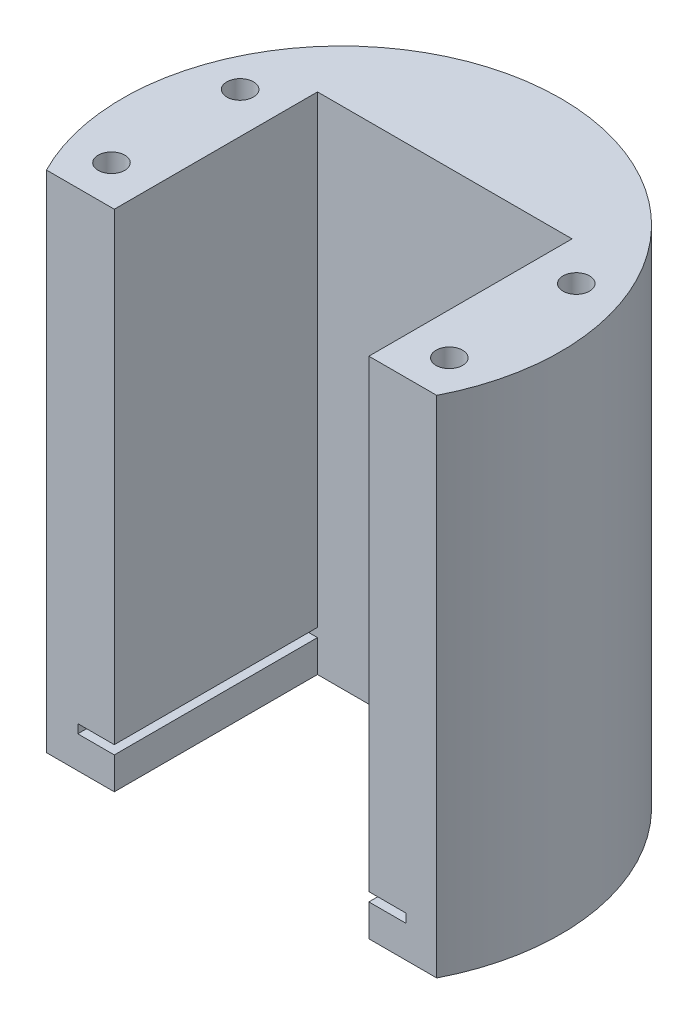
ISO-10303-21;
HEADER;
FILE_DESCRIPTION(('STEP AP214'),'2;1');
FILE_NAME('part.step','',(''),(''),'','','');
FILE_SCHEMA(('AUTOMOTIVE_DESIGN { 1 0 10303 214 1 1 1 1 }'));
ENDSEC;
DATA;
#1=APPLICATION_CONTEXT('core data for automotive mechanical design processes');
#2=APPLICATION_PROTOCOL_DEFINITION('international standard','automotive_design',2000,#1);
#3=PRODUCT_CONTEXT('',#1,'mechanical');
#4=PRODUCT('Part','Part','',(#3));
#5=PRODUCT_RELATED_PRODUCT_CATEGORY('part','',(#4));
#6=PRODUCT_DEFINITION_FORMATION('','',#4);
#7=PRODUCT_DEFINITION_CONTEXT('part definition',#1,'design');
#8=PRODUCT_DEFINITION('design','',#6,#7);
#9=PRODUCT_DEFINITION_SHAPE('','',#8);
#10=(LENGTH_UNIT() NAMED_UNIT(*) SI_UNIT(.MILLI.,.METRE.));
#11=(NAMED_UNIT(*) PLANE_ANGLE_UNIT() SI_UNIT($,.RADIAN.));
#12=(NAMED_UNIT(*) SI_UNIT($,.STERADIAN.) SOLID_ANGLE_UNIT());
#13=UNCERTAINTY_MEASURE_WITH_UNIT(LENGTH_MEASURE(1.E-05),#10,'distance_accuracy_value','');
#14=(GEOMETRIC_REPRESENTATION_CONTEXT(3) GLOBAL_UNCERTAINTY_ASSIGNED_CONTEXT((#13)) GLOBAL_UNIT_ASSIGNED_CONTEXT((#10,
#11,#12)) REPRESENTATION_CONTEXT('',''));
#15=CARTESIAN_POINT('',(0.,0.,0.));
#16=DIRECTION('',(0.,0.,1.));
#17=DIRECTION('',(1.,0.,0.));
#18=AXIS2_PLACEMENT_3D('',#15,#16,#17);
#19=CARTESIAN_POINT('',(-28.7576569336667,114.,0.));
#20=DIRECTION('',(-1.,0.,0.));
#21=DIRECTION('',(0.,0.,1.));
#22=AXIS2_PLACEMENT_3D('',#19,#20,#21);
#23=PLANE('',#22);
#24=DIRECTION('',(0.,-1.,0.));
#25=VECTOR('',#24,1.);
#26=CARTESIAN_POINT('',(-28.7576569336667,114.,-23.3211190092713));
#27=LINE('',#26,#25);
#28=CARTESIAN_POINT('',(-28.7576569336667,7.22982796789173,-23.3211190092712));
#29=VERTEX_POINT('',#28);
#30=CARTESIAN_POINT('',(-28.7576569336667,0.,-23.3211190092713));
#31=VERTEX_POINT('',#30);
#32=EDGE_CURVE('E292',#29,#31,#27,.T.);
#33=ORIENTED_EDGE('',*,*,#32,.F.);
#34=DIRECTION('',(0.,0.,1.));
#35=VECTOR('',#34,1.);
#36=CARTESIAN_POINT('',(-28.7576569336667,7.22982796789173,0.));
#37=LINE('',#36,#35);
#38=CARTESIAN_POINT('',(-28.7576569336667,7.22982796789173,22.5811058758501));
#39=VERTEX_POINT('',#38);
#40=EDGE_CURVE('E350',#29,#39,#37,.T.);
#41=ORIENTED_EDGE('',*,*,#40,.T.);
#42=DIRECTION('',(0.,-1.,0.));
#43=VECTOR('',#42,1.);
#44=CARTESIAN_POINT('',(-28.7576569336667,114.,22.5811058758501));
#45=LINE('',#44,#43);
#46=CARTESIAN_POINT('',(-28.7576569336667,0.,22.5811058758501));
#47=VERTEX_POINT('',#46);
#48=EDGE_CURVE('E281',#39,#47,#45,.T.);
#49=ORIENTED_EDGE('',*,*,#48,.T.);
#50=DIRECTION('',(0.,0.,-1.));
#51=VECTOR('',#50,1.);
#52=CARTESIAN_POINT('',(-28.7576569336667,0.,0.));
#53=LINE('',#52,#51);
#54=EDGE_CURVE('E401',#47,#31,#53,.T.);
#55=ORIENTED_EDGE('',*,*,#54,.T.);
#56=EDGE_LOOP('',(#33,#41,#49,#55));
#57=FACE_BOUND('',#56,.T.);
#58=ADVANCED_FACE('F45',(#57),#23,.F.);
#59=CARTESIAN_POINT('',(28.7576569336667,114.,0.));
#60=DIRECTION('',(-1.,0.,0.));
#61=DIRECTION('',(0.,0.,1.));
#62=AXIS2_PLACEMENT_3D('',#59,#60,#61);
#63=PLANE('',#62);
#64=DIRECTION('',(0.,0.,1.));
#65=VECTOR('',#64,1.);
#66=CARTESIAN_POINT('',(28.7576569336667,7.22982796789173,0.));
#67=LINE('',#66,#65);
#68=CARTESIAN_POINT('',(28.7576569336667,7.22982796789173,-23.3211190092713));
#69=VERTEX_POINT('',#68);
#70=CARTESIAN_POINT('',(28.7576569336667,7.22982796789173,22.5811058758501));
#71=VERTEX_POINT('',#70);
#72=EDGE_CURVE('E348',#69,#71,#67,.T.);
#73=ORIENTED_EDGE('',*,*,#72,.F.);
#74=DIRECTION('',(0.,-1.,0.));
#75=VECTOR('',#74,1.);
#76=CARTESIAN_POINT('',(28.7576569336667,114.,-23.3211190092713));
#77=LINE('',#76,#75);
#78=CARTESIAN_POINT('',(28.7576569336667,0.,-23.3211190092713));
#79=VERTEX_POINT('',#78);
#80=EDGE_CURVE('E200',#69,#79,#77,.T.);
#81=ORIENTED_EDGE('',*,*,#80,.T.);
#82=DIRECTION('',(0.,0.,-1.));
#83=VECTOR('',#82,1.);
#84=CARTESIAN_POINT('',(28.7576569336667,0.,0.));
#85=LINE('',#84,#83);
#86=CARTESIAN_POINT('',(28.7576569336667,0.,22.5811058758501));
#87=VERTEX_POINT('',#86);
#88=EDGE_CURVE('E405',#87,#79,#85,.T.);
#89=ORIENTED_EDGE('',*,*,#88,.F.);
#90=DIRECTION('',(0.,-1.,0.));
#91=VECTOR('',#90,1.);
#92=CARTESIAN_POINT('',(28.7576569336667,114.,22.5811058758501));
#93=LINE('',#92,#91);
#94=EDGE_CURVE('E385',#71,#87,#93,.T.);
#95=ORIENTED_EDGE('',*,*,#94,.F.);
#96=EDGE_LOOP('',(#73,#81,#89,#95));
#97=FACE_BOUND('',#96,.T.);
#98=ADVANCED_FACE('F416',(#97),#63,.T.);
#99=CARTESIAN_POINT('',(0.,114.,22.5811058758501));
#100=DIRECTION('',(0.,0.,-1.));
#101=DIRECTION('',(-1.,0.,0.));
#102=AXIS2_PLACEMENT_3D('',#99,#100,#101);
#103=PLANE('',#102);
#104=DIRECTION('',(0.,1.,0.));
#105=VECTOR('',#104,1.);
#106=CARTESIAN_POINT('',(37.1164505725113,7.22982796789173,22.5811058758501));
#107=LINE('',#106,#105);
#108=CARTESIAN_POINT('',(37.1164505725113,7.22982796789173,22.5811058758501));
#109=VERTEX_POINT('',#108);
#110=CARTESIAN_POINT('',(37.1164505725113,9.22982796789173,22.5811058758501));
#111=VERTEX_POINT('',#110);
#112=EDGE_CURVE('E253',#109,#111,#107,.T.);
#113=ORIENTED_EDGE('',*,*,#112,.F.);
#114=DIRECTION('',(1.,0.,0.));
#115=VECTOR('',#114,1.);
#116=CARTESIAN_POINT('',(-37.0063716597704,7.22982796789173,22.5811058758501));
#117=LINE('',#116,#115);
#118=EDGE_CURVE('E265',#71,#109,#117,.T.);
#119=ORIENTED_EDGE('',*,*,#118,.F.);
#120=ORIENTED_EDGE('',*,*,#94,.T.);
#121=DIRECTION('',(1.,0.,0.));
#122=VECTOR('',#121,1.);
#123=CARTESIAN_POINT('',(0.,0.,22.5811058758501));
#124=LINE('',#123,#122);
#125=CARTESIAN_POINT('',(44.0830416081246,0.,22.5811058758501));
#126=VERTEX_POINT('',#125);
#127=EDGE_CURVE('E394',#87,#126,#124,.T.);
#128=ORIENTED_EDGE('',*,*,#127,.T.);
#129=DIRECTION('',(0.,-1.,0.));
#130=VECTOR('',#129,1.);
#131=CARTESIAN_POINT('',(44.0830416081246,114.,22.5811058758501));
#132=LINE('',#131,#130);
#133=CARTESIAN_POINT('',(44.0830416081246,114.,22.5811058758501));
#134=VERTEX_POINT('',#133);
#135=EDGE_CURVE('E297',#134,#126,#132,.T.);
#136=ORIENTED_EDGE('',*,*,#135,.F.);
#137=DIRECTION('',(1.,0.,0.));
#138=VECTOR('',#137,1.);
#139=CARTESIAN_POINT('',(0.,114.,22.5811058758501));
#140=LINE('',#139,#138);
#141=CARTESIAN_POINT('',(28.7576569336667,114.,22.5811058758501));
#142=VERTEX_POINT('',#141);
#143=EDGE_CURVE('E367',#142,#134,#140,.T.);
#144=ORIENTED_EDGE('',*,*,#143,.F.);
#145=CARTESIAN_POINT('',(28.7576569336667,9.22982796789173,22.5811058758501));
#146=VERTEX_POINT('',#145);
#147=EDGE_CURVE('E263',#142,#146,#93,.T.);
#148=ORIENTED_EDGE('',*,*,#147,.T.);
#149=DIRECTION('',(-1.,0.,0.));
#150=VECTOR('',#149,1.);
#151=CARTESIAN_POINT('',(-37.0063716597704,9.22982796789173,22.5811058758501));
#152=LINE('',#151,#150);
#153=EDGE_CURVE('E68',#111,#146,#152,.T.);
#154=ORIENTED_EDGE('',*,*,#153,.F.);
#155=EDGE_LOOP('',(#113,#119,#120,#128,#136,#144,#148,#154));
#156=FACE_BOUND('',#155,.T.);
#157=ADVANCED_FACE('F261',(#156),#103,.F.);
#158=CARTESIAN_POINT('',(0.,114.,0.));
#159=DIRECTION('',(0.,-1.,0.));
#160=DIRECTION('',(0.,0.,-1.));
#161=AXIS2_PLACEMENT_3D('',#158,#159,#160);
#162=CYLINDRICAL_SURFACE('',#161,49.53);
#163=CARTESIAN_POINT('',(0.,0.,0.));
#164=DIRECTION('',(0.,1.,0.));
#165=DIRECTION('',(0.,0.,1.));
#166=AXIS2_PLACEMENT_3D('',#163,#164,#165);
#167=CIRCLE('',#166,49.53);
#168=CARTESIAN_POINT('',(-44.0830416081246,0.,22.5811058758501));
#169=VERTEX_POINT('',#168);
#170=EDGE_CURVE('E397',#126,#169,#167,.T.);
#171=ORIENTED_EDGE('',*,*,#170,.T.);
#172=DIRECTION('',(0.,-1.,0.));
#173=VECTOR('',#172,1.);
#174=CARTESIAN_POINT('',(-44.0830416081246,114.,22.5811058758501));
#175=LINE('',#174,#173);
#176=CARTESIAN_POINT('',(-44.0830416081246,114.,22.5811058758501));
#177=VERTEX_POINT('',#176);
#178=EDGE_CURVE('E291',#177,#169,#175,.T.);
#179=ORIENTED_EDGE('',*,*,#178,.F.);
#180=CARTESIAN_POINT('',(0.,114.,0.));
#181=DIRECTION('',(0.,1.,0.));
#182=DIRECTION('',(0.,0.,1.));
#183=AXIS2_PLACEMENT_3D('',#180,#181,#182);
#184=CIRCLE('',#183,49.53);
#185=EDGE_CURVE('E370',#134,#177,#184,.T.);
#186=ORIENTED_EDGE('',*,*,#185,.F.);
#187=ORIENTED_EDGE('',*,*,#135,.T.);
#188=EDGE_LOOP('',(#171,#179,#186,#187));
#189=FACE_BOUND('',#188,.T.);
#190=ADVANCED_FACE('F426',(#189),#162,.T.);
#191=CARTESIAN_POINT('',(0.,114.,22.5811058758501));
#192=DIRECTION('',(0.,0.,1.));
#193=DIRECTION('',(1.,0.,0.));
#194=AXIS2_PLACEMENT_3D('',#191,#192,#193);
#195=PLANE('',#194);
#196=CARTESIAN_POINT('',(-37.0063716597704,7.22982796789173,22.5811058758501));
#197=VERTEX_POINT('',#196);
#198=EDGE_CURVE('E258',#197,#39,#117,.T.);
#199=ORIENTED_EDGE('',*,*,#198,.F.);
#200=DIRECTION('',(0.,-1.,0.));
#201=VECTOR('',#200,1.);
#202=CARTESIAN_POINT('',(-37.0063716597704,7.22982796789173,22.5811058758501));
#203=LINE('',#202,#201);
#204=CARTESIAN_POINT('',(-37.0063716597704,9.22982796789173,22.5811058758501));
#205=VERTEX_POINT('',#204);
#206=EDGE_CURVE('E236',#205,#197,#203,.T.);
#207=ORIENTED_EDGE('',*,*,#206,.F.);
#208=CARTESIAN_POINT('',(-28.7576569336667,9.22982796789173,22.5811058758501));
#209=VERTEX_POINT('',#208);
#210=EDGE_CURVE('E257',#209,#205,#152,.T.);
#211=ORIENTED_EDGE('',*,*,#210,.F.);
#212=CARTESIAN_POINT('',(-28.7576569336667,114.,22.5811058758501));
#213=VERTEX_POINT('',#212);
#214=EDGE_CURVE('E287',#213,#209,#45,.T.);
#215=ORIENTED_EDGE('',*,*,#214,.F.);
#216=DIRECTION('',(-1.,0.,0.));
#217=VECTOR('',#216,1.);
#218=CARTESIAN_POINT('',(0.,114.,22.5811058758501));
#219=LINE('',#218,#217);
#220=EDGE_CURVE('E372',#213,#177,#219,.T.);
#221=ORIENTED_EDGE('',*,*,#220,.T.);
#222=ORIENTED_EDGE('',*,*,#178,.T.);
#223=DIRECTION('',(-1.,0.,0.));
#224=VECTOR('',#223,1.);
#225=CARTESIAN_POINT('',(0.,0.,22.5811058758501));
#226=LINE('',#225,#224);
#227=EDGE_CURVE('E283',#47,#169,#226,.T.);
#228=ORIENTED_EDGE('',*,*,#227,.F.);
#229=ORIENTED_EDGE('',*,*,#48,.F.);
#230=EDGE_LOOP('',(#199,#207,#211,#215,#221,#222,#228,#229));
#231=FACE_BOUND('',#230,.T.);
#232=ADVANCED_FACE('F279',(#231),#195,.T.);
#233=ORIENTED_EDGE('',*,*,#214,.T.);
#234=DIRECTION('',(0.,0.,-1.));
#235=VECTOR('',#234,1.);
#236=CARTESIAN_POINT('',(-28.7576569336667,9.22982796789173,0.));
#237=LINE('',#236,#235);
#238=CARTESIAN_POINT('',(-28.7576569336667,9.22982796789173,-23.3211190092713));
#239=VERTEX_POINT('',#238);
#240=EDGE_CURVE('E334',#209,#239,#237,.T.);
#241=ORIENTED_EDGE('',*,*,#240,.T.);
#242=CARTESIAN_POINT('',(-28.7576569336667,114.,-23.3211190092713));
#243=VERTEX_POINT('',#242);
#244=EDGE_CURVE('E288',#243,#239,#27,.T.);
#245=ORIENTED_EDGE('',*,*,#244,.F.);
#246=DIRECTION('',(0.,0.,-1.));
#247=VECTOR('',#246,1.);
#248=CARTESIAN_POINT('',(-28.7576569336667,114.,0.));
#249=LINE('',#248,#247);
#250=EDGE_CURVE('E375',#213,#243,#249,.T.);
#251=ORIENTED_EDGE('',*,*,#250,.F.);
#252=EDGE_LOOP('',(#233,#241,#245,#251));
#253=FACE_BOUND('',#252,.T.);
#254=ADVANCED_FACE('F438',(#253),#23,.F.);
#255=CARTESIAN_POINT('',(0.,114.,-23.3211190092713));
#256=DIRECTION('',(0.,0.,-1.));
#257=DIRECTION('',(-1.,0.,0.));
#258=AXIS2_PLACEMENT_3D('',#255,#256,#257);
#259=PLANE('',#258);
#260=ORIENTED_EDGE('',*,*,#244,.T.);
#261=DIRECTION('',(-1.,0.,0.));
#262=VECTOR('',#261,1.);
#263=CARTESIAN_POINT('',(-37.0063716597704,9.22982796789173,-23.3211190092712));
#264=LINE('',#263,#262);
#265=CARTESIAN_POINT('',(-37.0063716597704,9.22982796789173,-23.3211190092712));
#266=VERTEX_POINT('',#265);
#267=EDGE_CURVE('E60',#239,#266,#264,.T.);
#268=ORIENTED_EDGE('',*,*,#267,.T.);
#269=DIRECTION('',(0.,-1.,0.));
#270=VECTOR('',#269,1.);
#271=CARTESIAN_POINT('',(-37.0063716597704,7.22982796789173,-23.3211190092712));
#272=LINE('',#271,#270);
#273=CARTESIAN_POINT('',(-37.0063716597704,7.22982796789173,-23.3211190092712));
#274=VERTEX_POINT('',#273);
#275=EDGE_CURVE('E238',#266,#274,#272,.T.);
#276=ORIENTED_EDGE('',*,*,#275,.T.);
#277=DIRECTION('',(1.,0.,0.));
#278=VECTOR('',#277,1.);
#279=CARTESIAN_POINT('',(-37.0063716597704,7.22982796789173,-23.3211190092712));
#280=LINE('',#279,#278);
#281=EDGE_CURVE('E204',#274,#29,#280,.T.);
#282=ORIENTED_EDGE('',*,*,#281,.T.);
#283=ORIENTED_EDGE('',*,*,#32,.T.);
#284=DIRECTION('',(1.,0.,0.));
#285=VECTOR('',#284,1.);
#286=CARTESIAN_POINT('',(0.,0.,-23.3211190092713));
#287=LINE('',#286,#285);
#288=EDGE_CURVE('E403',#31,#79,#287,.T.);
#289=ORIENTED_EDGE('',*,*,#288,.T.);
#290=ORIENTED_EDGE('',*,*,#80,.F.);
#291=CARTESIAN_POINT('',(37.1164505725113,7.22982796789173,-23.3211190092712));
#292=VERTEX_POINT('',#291);
#293=EDGE_CURVE('E193',#69,#292,#280,.T.);
#294=ORIENTED_EDGE('',*,*,#293,.T.);
#295=DIRECTION('',(0.,1.,0.));
#296=VECTOR('',#295,1.);
#297=CARTESIAN_POINT('',(37.1164505725113,7.22982796789173,-23.3211190092712));
#298=LINE('',#297,#296);
#299=CARTESIAN_POINT('',(37.1164505725113,9.22982796789173,-23.3211190092712));
#300=VERTEX_POINT('',#299);
#301=EDGE_CURVE('E198',#292,#300,#298,.T.);
#302=ORIENTED_EDGE('',*,*,#301,.T.);
#303=CARTESIAN_POINT('',(28.7576569336667,9.22982796789173,-23.3211190092713));
#304=VERTEX_POINT('',#303);
#305=EDGE_CURVE('E242',#300,#304,#264,.T.);
#306=ORIENTED_EDGE('',*,*,#305,.T.);
#307=CARTESIAN_POINT('',(28.7576569336667,114.,-23.3211190092713));
#308=VERTEX_POINT('',#307);
#309=EDGE_CURVE('E410',#308,#304,#77,.T.);
#310=ORIENTED_EDGE('',*,*,#309,.F.);
#311=DIRECTION('',(1.,0.,0.));
#312=VECTOR('',#311,1.);
#313=CARTESIAN_POINT('',(0.,114.,-23.3211190092713));
#314=LINE('',#313,#312);
#315=EDGE_CURVE('E377',#243,#308,#314,.T.);
#316=ORIENTED_EDGE('',*,*,#315,.F.);
#317=EDGE_LOOP('',(#260,#268,#276,#282,#283,#289,#290,#294,#302,#306,#310,#316));
#318=FACE_BOUND('',#317,.T.);
#319=ADVANCED_FACE('F196',(#318),#259,.F.);
#320=DIRECTION('',(0.,0.,-1.));
#321=VECTOR('',#320,1.);
#322=CARTESIAN_POINT('',(28.7576569336667,9.22982796789173,0.));
#323=LINE('',#322,#321);
#324=EDGE_CURVE('E328',#146,#304,#323,.T.);
#325=ORIENTED_EDGE('',*,*,#324,.F.);
#326=ORIENTED_EDGE('',*,*,#147,.F.);
#327=DIRECTION('',(0.,0.,-1.));
#328=VECTOR('',#327,1.);
#329=CARTESIAN_POINT('',(28.7576569336667,114.,0.));
#330=LINE('',#329,#328);
#331=EDGE_CURVE('E379',#142,#308,#330,.T.);
#332=ORIENTED_EDGE('',*,*,#331,.T.);
#333=ORIENTED_EDGE('',*,*,#309,.T.);
#334=EDGE_LOOP('',(#325,#326,#332,#333));
#335=FACE_BOUND('',#334,.T.);
#336=ADVANCED_FACE('F433',(#335),#63,.T.);
#337=CARTESIAN_POINT('',(-38.1613419725484,114.,13.8126429549861));
#338=DIRECTION('',(0.,-1.,0.));
#339=DIRECTION('',(0.,0.,-1.));
#340=AXIS2_PLACEMENT_3D('',#337,#338,#339);
#341=CYLINDRICAL_SURFACE('',#340,3.);
#342=DIRECTION('',(0.,-1.,0.));
#343=VECTOR('',#342,1.);
#344=CARTESIAN_POINT('',(-37.0063716597704,114.,11.0438808531432));
#345=LINE('',#344,#343);
#346=CARTESIAN_POINT('',(-37.0063716597704,9.22982796789173,11.0438808531432));
#347=VERTEX_POINT('',#346);
#348=CARTESIAN_POINT('',(-37.0063716597704,7.22982796789173,11.0438808531432));
#349=VERTEX_POINT('',#348);
#350=EDGE_CURVE('E354',#347,#349,#345,.T.);
#351=ORIENTED_EDGE('',*,*,#350,.F.);
#352=CARTESIAN_POINT('',(-38.1613419725484,9.22982796789173,13.8126429549861));
#353=DIRECTION('',(0.,1.,0.));
#354=DIRECTION('',(0.,0.,1.));
#355=AXIS2_PLACEMENT_3D('',#352,#353,#354);
#356=CIRCLE('',#355,3.);
#357=CARTESIAN_POINT('',(-37.0063716597704,9.22982796789173,16.581405056829));
#358=VERTEX_POINT('',#357);
#359=EDGE_CURVE('E323',#358,#347,#356,.T.);
#360=ORIENTED_EDGE('',*,*,#359,.F.);
#361=DIRECTION('',(0.,-1.,0.));
#362=VECTOR('',#361,1.);
#363=CARTESIAN_POINT('',(-37.0063716597704,114.,16.581405056829));
#364=LINE('',#363,#362);
#365=CARTESIAN_POINT('',(-37.0063716597704,7.22982796789173,16.581405056829));
#366=VERTEX_POINT('',#365);
#367=EDGE_CURVE('E352',#366,#358,#364,.F.);
#368=ORIENTED_EDGE('',*,*,#367,.F.);
#369=CARTESIAN_POINT('',(-38.1613419725484,7.22982796789173,13.8126429549861));
#370=DIRECTION('',(0.,-1.,0.));
#371=DIRECTION('',(0.,0.,-1.));
#372=AXIS2_PLACEMENT_3D('',#369,#370,#371);
#373=CIRCLE('',#372,3.);
#374=EDGE_CURVE('E346',#349,#366,#373,.T.);
#375=ORIENTED_EDGE('',*,*,#374,.F.);
#376=EDGE_LOOP('',(#351,#360,#368,#375));
#377=FACE_BOUND('',#376,.T.);
#378=CARTESIAN_POINT('',(-38.1613419725484,114.,13.8126429549861));
#379=DIRECTION('',(0.,1.,0.));
#380=DIRECTION('',(0.,0.,1.));
#381=AXIS2_PLACEMENT_3D('',#378,#379,#380);
#382=CIRCLE('',#381,3.);
#383=CARTESIAN_POINT('',(-38.1613419725484,114.,16.8126429549861));
#384=VERTEX_POINT('',#383);
#385=EDGE_CURVE('E364',#384,#384,#382,.T.);
#386=ORIENTED_EDGE('',*,*,#385,.T.);
#387=EDGE_LOOP('',(#386));
#388=FACE_BOUND('',#387,.T.);
#389=CARTESIAN_POINT('',(-38.1613419725484,0.,13.8126429549861));
#390=DIRECTION('',(0.,1.,0.));
#391=DIRECTION('',(0.,0.,1.));
#392=AXIS2_PLACEMENT_3D('',#389,#390,#391);
#393=CIRCLE('',#392,3.);
#394=CARTESIAN_POINT('',(-38.1613419725484,0.,16.8126429549861));
#395=VERTEX_POINT('',#394);
#396=EDGE_CURVE('E391',#395,#395,#393,.T.);
#397=ORIENTED_EDGE('',*,*,#396,.F.);
#398=EDGE_LOOP('',(#397));
#399=FACE_BOUND('',#398,.T.);
#400=ADVANCED_FACE('F441',(#377,#388,#399),#341,.F.);
#401=CARTESIAN_POINT('',(-37.9712293616954,114.,-15.0603910993191));
#402=DIRECTION('',(0.,-1.,0.));
#403=DIRECTION('',(0.,0.,-1.));
#404=AXIS2_PLACEMENT_3D('',#401,#402,#403);
#405=CYLINDRICAL_SURFACE('',#404,3.);
#406=DIRECTION('',(0.,-1.,0.));
#407=VECTOR('',#406,1.);
#408=CARTESIAN_POINT('',(-37.0063716597704,114.,-17.9009983609862));
#409=LINE('',#408,#407);
#410=CARTESIAN_POINT('',(-37.0063716597704,9.22982796789173,-17.9009983609862));
#411=VERTEX_POINT('',#410);
#412=CARTESIAN_POINT('',(-37.0063716597704,7.22982796789173,-17.9009983609862));
#413=VERTEX_POINT('',#412);
#414=EDGE_CURVE('E11',#411,#413,#409,.T.);
#415=ORIENTED_EDGE('',*,*,#414,.F.);
#416=CARTESIAN_POINT('',(-37.9712293616954,9.22982796789173,-15.0603910993191));
#417=DIRECTION('',(0.,1.,0.));
#418=DIRECTION('',(0.,0.,1.));
#419=AXIS2_PLACEMENT_3D('',#416,#417,#418);
#420=CIRCLE('',#419,3.);
#421=CARTESIAN_POINT('',(-37.0063716597704,9.22982796789173,-12.219783837652));
#422=VERTEX_POINT('',#421);
#423=EDGE_CURVE('E321',#422,#411,#420,.T.);
#424=ORIENTED_EDGE('',*,*,#423,.F.);
#425=DIRECTION('',(0.,-1.,0.));
#426=VECTOR('',#425,1.);
#427=CARTESIAN_POINT('',(-37.0063716597704,114.,-12.219783837652));
#428=LINE('',#427,#426);
#429=CARTESIAN_POINT('',(-37.0063716597704,7.22982796789173,-12.219783837652));
#430=VERTEX_POINT('',#429);
#431=EDGE_CURVE('E53',#430,#422,#428,.F.);
#432=ORIENTED_EDGE('',*,*,#431,.F.);
#433=CARTESIAN_POINT('',(-37.9712293616954,7.22982796789173,-15.0603910993191));
#434=DIRECTION('',(0.,-1.,0.));
#435=DIRECTION('',(0.,0.,-1.));
#436=AXIS2_PLACEMENT_3D('',#433,#434,#435);
#437=CIRCLE('',#436,3.);
#438=EDGE_CURVE('E344',#413,#430,#437,.T.);
#439=ORIENTED_EDGE('',*,*,#438,.F.);
#440=EDGE_LOOP('',(#415,#424,#432,#439));
#441=FACE_BOUND('',#440,.T.);
#442=CARTESIAN_POINT('',(-37.9712293616954,114.,-15.0603910993191));
#443=DIRECTION('',(0.,1.,0.));
#444=DIRECTION('',(0.,0.,1.));
#445=AXIS2_PLACEMENT_3D('',#442,#443,#444);
#446=CIRCLE('',#445,3.);
#447=CARTESIAN_POINT('',(-37.9712293616954,114.,-12.0603910993191));
#448=VERTEX_POINT('',#447);
#449=EDGE_CURVE('E360',#448,#448,#446,.T.);
#450=ORIENTED_EDGE('',*,*,#449,.T.);
#451=EDGE_LOOP('',(#450));
#452=FACE_BOUND('',#451,.T.);
#453=CARTESIAN_POINT('',(-37.9712293616954,0.,-15.0603910993191));
#454=DIRECTION('',(0.,1.,0.));
#455=DIRECTION('',(0.,0.,1.));
#456=AXIS2_PLACEMENT_3D('',#453,#454,#455);
#457=CIRCLE('',#456,3.);
#458=CARTESIAN_POINT('',(-37.9712293616954,0.,-12.0603910993191));
#459=VERTEX_POINT('',#458);
#460=EDGE_CURVE('E388',#459,#459,#457,.T.);
#461=ORIENTED_EDGE('',*,*,#460,.F.);
#462=EDGE_LOOP('',(#461));
#463=FACE_BOUND('',#462,.T.);
#464=ADVANCED_FACE('F325',(#441,#452,#463),#405,.F.);
#465=CARTESIAN_POINT('',(38.1613419725484,114.,13.8126429549861));
#466=DIRECTION('',(0.,-1.,0.));
#467=DIRECTION('',(0.,0.,-1.));
#468=AXIS2_PLACEMENT_3D('',#465,#466,#467);
#469=CYLINDRICAL_SURFACE('',#468,3.);
#470=DIRECTION('',(0.,-1.,0.));
#471=VECTOR('',#470,1.);
#472=CARTESIAN_POINT('',(37.1164505725113,114.,11.0004904054027));
#473=LINE('',#472,#471);
#474=CARTESIAN_POINT('',(37.1164505725113,9.22982796789173,11.0004904054027));
#475=VERTEX_POINT('',#474);
#476=CARTESIAN_POINT('',(37.1164505725113,7.22982796789173,11.0004904054027));
#477=VERTEX_POINT('',#476);
#478=EDGE_CURVE('E336',#475,#477,#473,.T.);
#479=ORIENTED_EDGE('',*,*,#478,.T.);
#480=CARTESIAN_POINT('',(38.1613419725484,7.22982796789173,13.8126429549861));
#481=DIRECTION('',(0.,-1.,0.));
#482=DIRECTION('',(0.,0.,-1.));
#483=AXIS2_PLACEMENT_3D('',#480,#481,#482);
#484=CIRCLE('',#483,3.);
#485=CARTESIAN_POINT('',(37.1164505725113,7.22982796789173,16.6247955045695));
#486=VERTEX_POINT('',#485);
#487=EDGE_CURVE('E341',#477,#486,#484,.F.);
#488=ORIENTED_EDGE('',*,*,#487,.T.);
#489=DIRECTION('',(0.,-1.,0.));
#490=VECTOR('',#489,1.);
#491=CARTESIAN_POINT('',(37.1164505725113,114.,16.6247955045695));
#492=LINE('',#491,#490);
#493=CARTESIAN_POINT('',(37.1164505725113,9.22982796789173,16.6247955045695));
#494=VERTEX_POINT('',#493);
#495=EDGE_CURVE('E339',#486,#494,#492,.F.);
#496=ORIENTED_EDGE('',*,*,#495,.T.);
#497=CARTESIAN_POINT('',(38.1613419725484,9.22982796789173,13.8126429549861));
#498=DIRECTION('',(0.,1.,0.));
#499=DIRECTION('',(0.,0.,1.));
#500=AXIS2_PLACEMENT_3D('',#497,#498,#499);
#501=CIRCLE('',#500,3.);
#502=EDGE_CURVE('E251',#494,#475,#501,.F.);
#503=ORIENTED_EDGE('',*,*,#502,.T.);
#504=EDGE_LOOP('',(#479,#488,#496,#503));
#505=FACE_BOUND('',#504,.T.);
#506=CARTESIAN_POINT('',(38.1613419725484,114.,13.8126429549861));
#507=DIRECTION('',(0.,1.,0.));
#508=DIRECTION('',(0.,0.,1.));
#509=AXIS2_PLACEMENT_3D('',#506,#507,#508);
#510=CIRCLE('',#509,3.);
#511=CARTESIAN_POINT('',(38.1613419725484,114.,16.8126429549861));
#512=VERTEX_POINT('',#511);
#513=EDGE_CURVE('E357',#512,#512,#510,.F.);
#514=ORIENTED_EDGE('',*,*,#513,.F.);
#515=EDGE_LOOP('',(#514));
#516=FACE_BOUND('',#515,.T.);
#517=CARTESIAN_POINT('',(38.1613419725484,0.,13.8126429549861));
#518=DIRECTION('',(0.,1.,0.));
#519=DIRECTION('',(0.,0.,1.));
#520=AXIS2_PLACEMENT_3D('',#517,#518,#519);
#521=CIRCLE('',#520,3.);
#522=CARTESIAN_POINT('',(38.1613419725484,0.,16.8126429549861));
#523=VERTEX_POINT('',#522);
#524=EDGE_CURVE('E356',#523,#523,#521,.F.);
#525=ORIENTED_EDGE('',*,*,#524,.T.);
#526=EDGE_LOOP('',(#525));
#527=FACE_BOUND('',#526,.T.);
#528=ADVANCED_FACE('F47',(#505,#516,#527),#469,.F.);
#529=CARTESIAN_POINT('',(37.9712293616954,114.,-15.0603910993191));
#530=DIRECTION('',(0.,-1.,0.));
#531=DIRECTION('',(0.,0.,-1.));
#532=AXIS2_PLACEMENT_3D('',#529,#530,#531);
#533=CYLINDRICAL_SURFACE('',#532,3.);
#534=DIRECTION('',(0.,-1.,0.));
#535=VECTOR('',#534,1.);
#536=CARTESIAN_POINT('',(37.1164505725113,114.,-17.9360394125801));
#537=LINE('',#536,#535);
#538=CARTESIAN_POINT('',(37.1164505725113,9.22982796789173,-17.9360394125801));
#539=VERTEX_POINT('',#538);
#540=CARTESIAN_POINT('',(37.1164505725113,7.22982796789173,-17.9360394125801));
#541=VERTEX_POINT('',#540);
#542=EDGE_CURVE('E303',#539,#541,#537,.T.);
#543=ORIENTED_EDGE('',*,*,#542,.T.);
#544=CARTESIAN_POINT('',(37.9712293616954,7.22982796789173,-15.0603910993191));
#545=DIRECTION('',(0.,-1.,0.));
#546=DIRECTION('',(0.,0.,-1.));
#547=AXIS2_PLACEMENT_3D('',#544,#545,#546);
#548=CIRCLE('',#547,3.);
#549=CARTESIAN_POINT('',(37.1164505725113,7.22982796789173,-12.1847427860581));
#550=VERTEX_POINT('',#549);
#551=EDGE_CURVE('E219',#541,#550,#548,.F.);
#552=ORIENTED_EDGE('',*,*,#551,.T.);
#553=DIRECTION('',(0.,-1.,0.));
#554=VECTOR('',#553,1.);
#555=CARTESIAN_POINT('',(37.1164505725113,114.,-12.1847427860581));
#556=LINE('',#555,#554);
#557=CARTESIAN_POINT('',(37.1164505725113,9.22982796789173,-12.1847427860581));
#558=VERTEX_POINT('',#557);
#559=EDGE_CURVE('E305',#550,#558,#556,.F.);
#560=ORIENTED_EDGE('',*,*,#559,.T.);
#561=CARTESIAN_POINT('',(37.9712293616954,9.22982796789173,-15.0603910993191));
#562=DIRECTION('',(0.,1.,0.));
#563=DIRECTION('',(0.,0.,1.));
#564=AXIS2_PLACEMENT_3D('',#561,#562,#563);
#565=CIRCLE('',#564,3.);
#566=EDGE_CURVE('E300',#558,#539,#565,.F.);
#567=ORIENTED_EDGE('',*,*,#566,.T.);
#568=EDGE_LOOP('',(#543,#552,#560,#567));
#569=FACE_BOUND('',#568,.T.);
#570=CARTESIAN_POINT('',(37.9712293616954,114.,-15.0603910993191));
#571=DIRECTION('',(0.,1.,0.));
#572=DIRECTION('',(0.,0.,1.));
#573=AXIS2_PLACEMENT_3D('',#570,#571,#572);
#574=CIRCLE('',#573,3.);
#575=CARTESIAN_POINT('',(37.9712293616954,114.,-12.0603910993191));
#576=VERTEX_POINT('',#575);
#577=EDGE_CURVE('E382',#576,#576,#574,.F.);
#578=ORIENTED_EDGE('',*,*,#577,.F.);
#579=EDGE_LOOP('',(#578));
#580=FACE_BOUND('',#579,.T.);
#581=CARTESIAN_POINT('',(37.9712293616954,0.,-15.0603910993191));
#582=DIRECTION('',(0.,1.,0.));
#583=DIRECTION('',(0.,0.,1.));
#584=AXIS2_PLACEMENT_3D('',#581,#582,#583);
#585=CIRCLE('',#584,3.);
#586=CARTESIAN_POINT('',(37.9712293616954,0.,-12.0603910993191));
#587=VERTEX_POINT('',#586);
#588=EDGE_CURVE('E361',#587,#587,#585,.F.);
#589=ORIENTED_EDGE('',*,*,#588,.T.);
#590=EDGE_LOOP('',(#589));
#591=FACE_BOUND('',#590,.T.);
#592=ADVANCED_FACE('F483',(#569,#580,#591),#533,.F.);
#593=CARTESIAN_POINT('',(0.,114.,0.));
#594=DIRECTION('',(0.,1.,0.));
#595=DIRECTION('',(0.,0.,1.));
#596=AXIS2_PLACEMENT_3D('',#593,#594,#595);
#597=PLANE('',#596);
#598=ORIENTED_EDGE('',*,*,#513,.T.);
#599=EDGE_LOOP('',(#598));
#600=FACE_BOUND('',#599,.T.);
#601=ORIENTED_EDGE('',*,*,#449,.F.);
#602=EDGE_LOOP('',(#601));
#603=FACE_BOUND('',#602,.T.);
#604=ORIENTED_EDGE('',*,*,#385,.F.);
#605=EDGE_LOOP('',(#604));
#606=FACE_BOUND('',#605,.T.);
#607=ORIENTED_EDGE('',*,*,#143,.T.);
#608=ORIENTED_EDGE('',*,*,#185,.T.);
#609=ORIENTED_EDGE('',*,*,#220,.F.);
#610=ORIENTED_EDGE('',*,*,#250,.T.);
#611=ORIENTED_EDGE('',*,*,#315,.T.);
#612=ORIENTED_EDGE('',*,*,#331,.F.);
#613=EDGE_LOOP('',(#607,#608,#609,#610,#611,#612));
#614=FACE_BOUND('',#613,.T.);
#615=ORIENTED_EDGE('',*,*,#577,.T.);
#616=EDGE_LOOP('',(#615));
#617=FACE_BOUND('',#616,.T.);
#618=ADVANCED_FACE('F430',(#600,#603,#606,#614,#617),#597,.T.);
#619=CARTESIAN_POINT('',(0.,0.,0.));
#620=DIRECTION('',(0.,1.,0.));
#621=DIRECTION('',(0.,0.,1.));
#622=AXIS2_PLACEMENT_3D('',#619,#620,#621);
#623=PLANE('',#622);
#624=ORIENTED_EDGE('',*,*,#524,.F.);
#625=EDGE_LOOP('',(#624));
#626=FACE_BOUND('',#625,.T.);
#627=ORIENTED_EDGE('',*,*,#460,.T.);
#628=EDGE_LOOP('',(#627));
#629=FACE_BOUND('',#628,.T.);
#630=ORIENTED_EDGE('',*,*,#396,.T.);
#631=EDGE_LOOP('',(#630));
#632=FACE_BOUND('',#631,.T.);
#633=ORIENTED_EDGE('',*,*,#127,.F.);
#634=ORIENTED_EDGE('',*,*,#88,.T.);
#635=ORIENTED_EDGE('',*,*,#288,.F.);
#636=ORIENTED_EDGE('',*,*,#54,.F.);
#637=ORIENTED_EDGE('',*,*,#227,.T.);
#638=ORIENTED_EDGE('',*,*,#170,.F.);
#639=EDGE_LOOP('',(#633,#634,#635,#636,#637,#638));
#640=FACE_BOUND('',#639,.T.);
#641=ORIENTED_EDGE('',*,*,#588,.F.);
#642=EDGE_LOOP('',(#641));
#643=FACE_BOUND('',#642,.T.);
#644=ADVANCED_FACE('F421',(#626,#629,#632,#640,#643),#623,.F.);
#645=CARTESIAN_POINT('',(-37.0063716597704,9.22982796789173,-97.4709185752743));
#646=DIRECTION('',(0.,1.,0.));
#647=DIRECTION('',(0.,0.,1.));
#648=AXIS2_PLACEMENT_3D('',#645,#646,#647);
#649=PLANE('',#648);
#650=ORIENTED_EDGE('',*,*,#324,.T.);
#651=ORIENTED_EDGE('',*,*,#305,.F.);
#652=DIRECTION('',(0.,0.,1.));
#653=VECTOR('',#652,1.);
#654=CARTESIAN_POINT('',(37.1164505725113,9.22982796789173,-97.4709185752743));
#655=LINE('',#654,#653);
#656=EDGE_CURVE('E213',#300,#539,#655,.T.);
#657=ORIENTED_EDGE('',*,*,#656,.T.);
#658=ORIENTED_EDGE('',*,*,#566,.F.);
#659=EDGE_CURVE('E247',#558,#475,#655,.T.);
#660=ORIENTED_EDGE('',*,*,#659,.T.);
#661=ORIENTED_EDGE('',*,*,#502,.F.);
#662=EDGE_CURVE('E214',#494,#111,#655,.T.);
#663=ORIENTED_EDGE('',*,*,#662,.T.);
#664=ORIENTED_EDGE('',*,*,#153,.T.);
#665=EDGE_LOOP('',(#650,#651,#657,#658,#660,#661,#663,#664));
#666=FACE_BOUND('',#665,.T.);
#667=ADVANCED_FACE('F249',(#666),#649,.F.);
#668=CARTESIAN_POINT('',(37.1164505725113,7.22982796789173,-97.4709185752743));
#669=DIRECTION('',(1.,0.,0.));
#670=DIRECTION('',(0.,0.,-1.));
#671=AXIS2_PLACEMENT_3D('',#668,#669,#670);
#672=PLANE('',#671);
#673=ORIENTED_EDGE('',*,*,#656,.F.);
#674=ORIENTED_EDGE('',*,*,#301,.F.);
#675=DIRECTION('',(0.,0.,1.));
#676=VECTOR('',#675,1.);
#677=CARTESIAN_POINT('',(37.1164505725113,7.22982796789173,-97.4709185752743));
#678=LINE('',#677,#676);
#679=EDGE_CURVE('E211',#292,#541,#678,.T.);
#680=ORIENTED_EDGE('',*,*,#679,.T.);
#681=ORIENTED_EDGE('',*,*,#542,.F.);
#682=EDGE_LOOP('',(#673,#674,#680,#681));
#683=FACE_BOUND('',#682,.T.);
#684=ADVANCED_FACE('F209',(#683),#672,.F.);
#685=ORIENTED_EDGE('',*,*,#659,.F.);
#686=ORIENTED_EDGE('',*,*,#559,.F.);
#687=EDGE_CURVE('E220',#550,#477,#678,.T.);
#688=ORIENTED_EDGE('',*,*,#687,.T.);
#689=ORIENTED_EDGE('',*,*,#478,.F.);
#690=EDGE_LOOP('',(#685,#686,#688,#689));
#691=FACE_BOUND('',#690,.T.);
#692=ADVANCED_FACE('F658',(#691),#672,.F.);
#693=CARTESIAN_POINT('',(-37.0063716597704,7.22982796789173,-97.4709185752743));
#694=DIRECTION('',(0.,-1.,0.));
#695=DIRECTION('',(0.,0.,-1.));
#696=AXIS2_PLACEMENT_3D('',#693,#694,#695);
#697=PLANE('',#696);
#698=ORIENTED_EDGE('',*,*,#72,.T.);
#699=ORIENTED_EDGE('',*,*,#118,.T.);
#700=EDGE_CURVE('E222',#486,#109,#678,.T.);
#701=ORIENTED_EDGE('',*,*,#700,.F.);
#702=ORIENTED_EDGE('',*,*,#487,.F.);
#703=ORIENTED_EDGE('',*,*,#687,.F.);
#704=ORIENTED_EDGE('',*,*,#551,.F.);
#705=ORIENTED_EDGE('',*,*,#679,.F.);
#706=ORIENTED_EDGE('',*,*,#293,.F.);
#707=EDGE_LOOP('',(#698,#699,#701,#702,#703,#704,#705,#706));
#708=FACE_BOUND('',#707,.T.);
#709=ADVANCED_FACE('F216',(#708),#697,.F.);
#710=ORIENTED_EDGE('',*,*,#700,.T.);
#711=ORIENTED_EDGE('',*,*,#112,.T.);
#712=ORIENTED_EDGE('',*,*,#662,.F.);
#713=ORIENTED_EDGE('',*,*,#495,.F.);
#714=EDGE_LOOP('',(#710,#711,#712,#713));
#715=FACE_BOUND('',#714,.T.);
#716=ADVANCED_FACE('F254',(#715),#672,.F.);
#717=CARTESIAN_POINT('',(-37.0063716597704,7.22982796789173,-97.4709185752743));
#718=DIRECTION('',(-1.,0.,0.));
#719=DIRECTION('',(0.,0.,1.));
#720=AXIS2_PLACEMENT_3D('',#717,#718,#719);
#721=PLANE('',#720);
#722=ORIENTED_EDGE('',*,*,#350,.T.);
#723=DIRECTION('',(0.,0.,1.));
#724=VECTOR('',#723,1.);
#725=CARTESIAN_POINT('',(-37.0063716597704,7.22982796789173,-97.4709185752743));
#726=LINE('',#725,#724);
#727=EDGE_CURVE('E315',#430,#349,#726,.T.);
#728=ORIENTED_EDGE('',*,*,#727,.F.);
#729=ORIENTED_EDGE('',*,*,#431,.T.);
#730=DIRECTION('',(0.,0.,1.));
#731=VECTOR('',#730,1.);
#732=CARTESIAN_POINT('',(-37.0063716597704,9.22982796789173,-97.4709185752743));
#733=LINE('',#732,#731);
#734=EDGE_CURVE('E246',#422,#347,#733,.T.);
#735=ORIENTED_EDGE('',*,*,#734,.T.);
#736=EDGE_LOOP('',(#722,#728,#729,#735));
#737=FACE_BOUND('',#736,.T.);
#738=ADVANCED_FACE('F312',(#737),#721,.F.);
#739=ORIENTED_EDGE('',*,*,#414,.T.);
#740=EDGE_CURVE('E330',#274,#413,#726,.T.);
#741=ORIENTED_EDGE('',*,*,#740,.F.);
#742=ORIENTED_EDGE('',*,*,#275,.F.);
#743=EDGE_CURVE('E241',#266,#411,#733,.T.);
#744=ORIENTED_EDGE('',*,*,#743,.T.);
#745=EDGE_LOOP('',(#739,#741,#742,#744));
#746=FACE_BOUND('',#745,.T.);
#747=ADVANCED_FACE('F448',(#746),#721,.F.);
#748=ORIENTED_EDGE('',*,*,#281,.F.);
#749=ORIENTED_EDGE('',*,*,#740,.T.);
#750=ORIENTED_EDGE('',*,*,#438,.T.);
#751=ORIENTED_EDGE('',*,*,#727,.T.);
#752=ORIENTED_EDGE('',*,*,#374,.T.);
#753=EDGE_CURVE('E240',#366,#197,#726,.T.);
#754=ORIENTED_EDGE('',*,*,#753,.T.);
#755=ORIENTED_EDGE('',*,*,#198,.T.);
#756=ORIENTED_EDGE('',*,*,#40,.F.);
#757=EDGE_LOOP('',(#748,#749,#750,#751,#752,#754,#755,#756));
#758=FACE_BOUND('',#757,.T.);
#759=ADVANCED_FACE('F444',(#758),#697,.F.);
#760=ORIENTED_EDGE('',*,*,#210,.T.);
#761=EDGE_CURVE('E243',#358,#205,#733,.T.);
#762=ORIENTED_EDGE('',*,*,#761,.F.);
#763=ORIENTED_EDGE('',*,*,#359,.T.);
#764=ORIENTED_EDGE('',*,*,#734,.F.);
#765=ORIENTED_EDGE('',*,*,#423,.T.);
#766=ORIENTED_EDGE('',*,*,#743,.F.);
#767=ORIENTED_EDGE('',*,*,#267,.F.);
#768=ORIENTED_EDGE('',*,*,#240,.F.);
#769=EDGE_LOOP('',(#760,#762,#763,#764,#765,#766,#767,#768));
#770=FACE_BOUND('',#769,.T.);
#771=ADVANCED_FACE('F320',(#770),#649,.F.);
#772=ORIENTED_EDGE('',*,*,#367,.T.);
#773=ORIENTED_EDGE('',*,*,#761,.T.);
#774=ORIENTED_EDGE('',*,*,#206,.T.);
#775=ORIENTED_EDGE('',*,*,#753,.F.);
#776=EDGE_LOOP('',(#772,#773,#774,#775));
#777=FACE_BOUND('',#776,.T.);
#778=ADVANCED_FACE('F273',(#777),#721,.F.);
#779=CLOSED_SHELL('',(#58,#98,#157,#190,#232,#254,#319,#336,#400,#464,#528,#592,#618,#644,#667,
#684,#692,#709,#716,#738,#747,#759,#771,#778));
#780=MANIFOLD_SOLID_BREP('B2',#779);
#781=ADVANCED_BREP_SHAPE_REPRESENTATION('',(#18,#780),#14);
#782=SHAPE_DEFINITION_REPRESENTATION(#9,#781);
ENDSEC;
END-ISO-10303-21;
